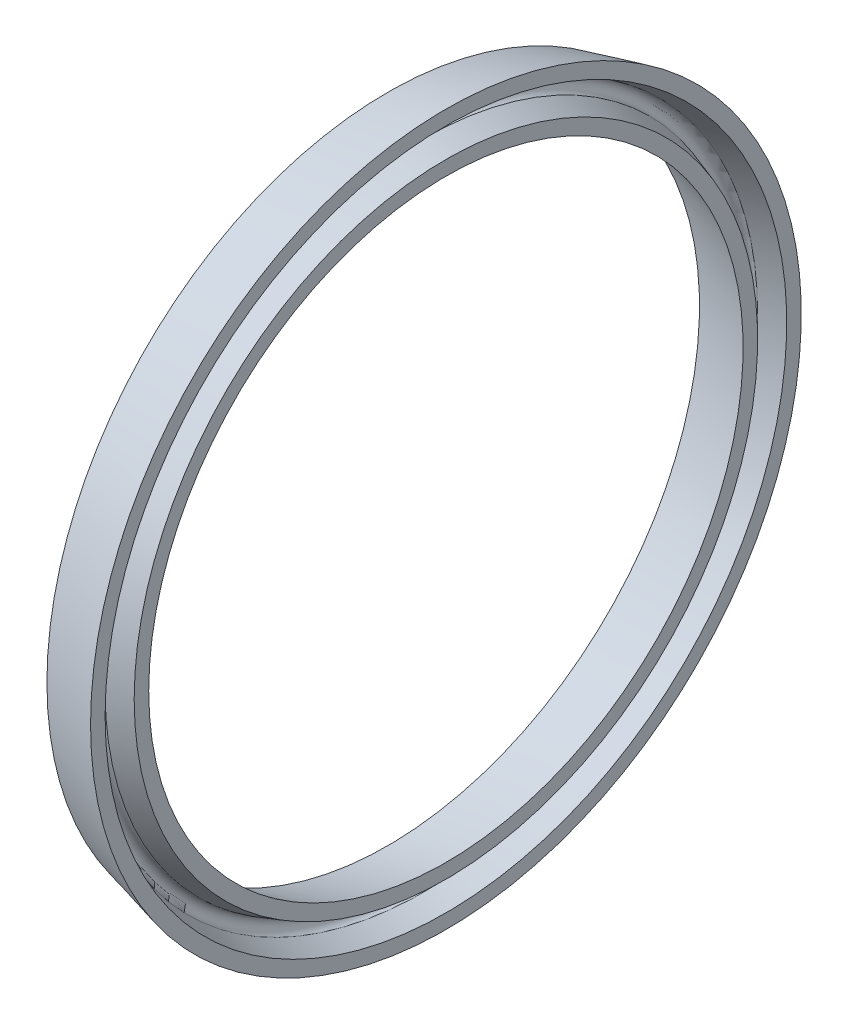
ISO-10303-21;
HEADER;
FILE_DESCRIPTION(('STEP AP214'),'2;1');
FILE_NAME('part.step','',(''),(''),'','','');
FILE_SCHEMA(('AUTOMOTIVE_DESIGN { 1 0 10303 214 1 1 1 1 }'));
ENDSEC;
DATA;
#1=APPLICATION_CONTEXT('core data for automotive mechanical design processes');
#2=APPLICATION_PROTOCOL_DEFINITION('international standard','automotive_design',2000,#1);
#3=PRODUCT_CONTEXT('',#1,'mechanical');
#4=PRODUCT('Part','Part','',(#3));
#5=PRODUCT_RELATED_PRODUCT_CATEGORY('part','',(#4));
#6=PRODUCT_DEFINITION_FORMATION('','',#4);
#7=PRODUCT_DEFINITION_CONTEXT('part definition',#1,'design');
#8=PRODUCT_DEFINITION('design','',#6,#7);
#9=PRODUCT_DEFINITION_SHAPE('','',#8);
#10=(LENGTH_UNIT() NAMED_UNIT(*) SI_UNIT(.MILLI.,.METRE.));
#11=(NAMED_UNIT(*) PLANE_ANGLE_UNIT() SI_UNIT($,.RADIAN.));
#12=(NAMED_UNIT(*) SI_UNIT($,.STERADIAN.) SOLID_ANGLE_UNIT());
#13=UNCERTAINTY_MEASURE_WITH_UNIT(LENGTH_MEASURE(1.E-05),#10,'distance_accuracy_value','');
#14=(GEOMETRIC_REPRESENTATION_CONTEXT(3) GLOBAL_UNCERTAINTY_ASSIGNED_CONTEXT((#13)) GLOBAL_UNIT_ASSIGNED_CONTEXT((#10,
#11,#12)) REPRESENTATION_CONTEXT('',''));
#15=CARTESIAN_POINT('',(0.,0.,0.));
#16=DIRECTION('',(0.,0.,1.));
#17=DIRECTION('',(1.,0.,0.));
#18=AXIS2_PLACEMENT_3D('',#15,#16,#17);
#19=CARTESIAN_POINT('',(0.,70.3100000000031,0.));
#20=DIRECTION('',(-1.,0.,0.));
#21=DIRECTION('',(0.,0.,1.));
#22=AXIS2_PLACEMENT_3D('',#19,#20,#21);
#23=PLANE('',#22);
#24=CARTESIAN_POINT('',(0.,0.,0.));
#25=DIRECTION('',(-1.,0.,0.));
#26=DIRECTION('',(0.,0.,1.));
#27=AXIS2_PLACEMENT_3D('',#24,#25,#26);
#28=CIRCLE('',#27,73.31);
#29=CARTESIAN_POINT('',(0.,0.,73.31));
#30=VERTEX_POINT('',#29);
#31=EDGE_CURVE('E10',#30,#30,#28,.T.);
#32=ORIENTED_EDGE('',*,*,#31,.F.);
#33=EDGE_LOOP('',(#32));
#34=FACE_BOUND('',#33,.T.);
#35=CARTESIAN_POINT('',(0.,0.,0.));
#36=DIRECTION('',(-1.,0.,0.));
#37=DIRECTION('',(0.,0.,1.));
#38=AXIS2_PLACEMENT_3D('',#35,#36,#37);
#39=CIRCLE('',#38,70.3100000000031);
#40=CARTESIAN_POINT('',(0.,0.,70.3100000000031));
#41=VERTEX_POINT('',#40);
#42=EDGE_CURVE('E67',#41,#41,#39,.T.);
#43=ORIENTED_EDGE('',*,*,#42,.T.);
#44=EDGE_LOOP('',(#43));
#45=FACE_BOUND('',#44,.T.);
#46=ADVANCED_FACE('F39',(#34,#45),#23,.F.);
#47=CARTESIAN_POINT('',(0.,0.,0.));
#48=DIRECTION('',(1.,0.,0.));
#49=DIRECTION('',(0.,0.,-1.));
#50=AXIS2_PLACEMENT_3D('',#47,#48,#49);
#51=CONICAL_SURFACE('',#50,73.31,0.244978663126863);
#52=CARTESIAN_POINT('',(-12.,0.,0.));
#53=DIRECTION('',(-1.,0.,0.));
#54=DIRECTION('',(0.,0.,1.));
#55=AXIS2_PLACEMENT_3D('',#52,#53,#54);
#56=CIRCLE('',#55,70.31);
#57=CARTESIAN_POINT('',(-12.,0.,70.31));
#58=VERTEX_POINT('',#57);
#59=EDGE_CURVE('E45',#58,#58,#56,.T.);
#60=ORIENTED_EDGE('',*,*,#59,.F.);
#61=EDGE_LOOP('',(#60));
#62=FACE_BOUND('',#61,.T.);
#63=ORIENTED_EDGE('',*,*,#31,.T.);
#64=EDGE_LOOP('',(#63));
#65=FACE_BOUND('',#64,.T.);
#66=ADVANCED_FACE('F104',(#62,#65),#51,.T.);
#67=CARTESIAN_POINT('',(-12.,70.31,0.));
#68=DIRECTION('',(1.,0.,0.));
#69=DIRECTION('',(0.,0.,-1.));
#70=AXIS2_PLACEMENT_3D('',#67,#68,#69);
#71=PLANE('',#70);
#72=CARTESIAN_POINT('',(-12.,0.,0.));
#73=DIRECTION('',(-1.,0.,0.));
#74=DIRECTION('',(0.,0.,1.));
#75=AXIS2_PLACEMENT_3D('',#72,#73,#74);
#76=CIRCLE('',#75,64.31);
#77=CARTESIAN_POINT('',(-12.,0.,64.31));
#78=VERTEX_POINT('',#77);
#79=EDGE_CURVE('E49',#78,#78,#76,.T.);
#80=ORIENTED_EDGE('',*,*,#79,.F.);
#81=EDGE_LOOP('',(#80));
#82=FACE_BOUND('',#81,.T.);
#83=ORIENTED_EDGE('',*,*,#59,.T.);
#84=EDGE_LOOP('',(#83));
#85=FACE_BOUND('',#84,.T.);
#86=ADVANCED_FACE('F99',(#82,#85),#71,.F.);
#87=CARTESIAN_POINT('',(-12.,0.,0.));
#88=DIRECTION('',(-1.,0.,0.));
#89=DIRECTION('',(0.,0.,1.));
#90=AXIS2_PLACEMENT_3D('',#87,#88,#89);
#91=CONICAL_SURFACE('',#90,64.31,0.244978663126863);
#92=CARTESIAN_POINT('',(0.,0.,0.));
#93=DIRECTION('',(-1.,0.,0.));
#94=DIRECTION('',(0.,0.,1.));
#95=AXIS2_PLACEMENT_3D('',#92,#93,#94);
#96=CIRCLE('',#95,61.31);
#97=CARTESIAN_POINT('',(0.,0.,61.31));
#98=VERTEX_POINT('',#97);
#99=EDGE_CURVE('E53',#98,#98,#96,.T.);
#100=ORIENTED_EDGE('',*,*,#99,.F.);
#101=EDGE_LOOP('',(#100));
#102=FACE_BOUND('',#101,.T.);
#103=ORIENTED_EDGE('',*,*,#79,.T.);
#104=EDGE_LOOP('',(#103));
#105=FACE_BOUND('',#104,.T.);
#106=ADVANCED_FACE('F93',(#102,#105),#91,.F.);
#107=CARTESIAN_POINT('',(0.,61.31,0.));
#108=DIRECTION('',(-1.,0.,0.));
#109=DIRECTION('',(0.,0.,1.));
#110=AXIS2_PLACEMENT_3D('',#107,#108,#109);
#111=PLANE('',#110);
#112=CARTESIAN_POINT('',(0.,0.,0.));
#113=DIRECTION('',(-1.,0.,0.));
#114=DIRECTION('',(0.,0.,1.));
#115=AXIS2_PLACEMENT_3D('',#112,#113,#114);
#116=CIRCLE('',#115,64.31);
#117=CARTESIAN_POINT('',(0.,0.,64.31));
#118=VERTEX_POINT('',#117);
#119=EDGE_CURVE('E58',#118,#118,#116,.T.);
#120=ORIENTED_EDGE('',*,*,#119,.F.);
#121=EDGE_LOOP('',(#120));
#122=FACE_BOUND('',#121,.T.);
#123=ORIENTED_EDGE('',*,*,#99,.T.);
#124=EDGE_LOOP('',(#123));
#125=FACE_BOUND('',#124,.T.);
#126=ADVANCED_FACE('F87',(#122,#125),#111,.F.);
#127=CARTESIAN_POINT('',(0.,0.,0.));
#128=DIRECTION('',(-1.,0.,0.));
#129=DIRECTION('',(0.,0.,1.));
#130=AXIS2_PLACEMENT_3D('',#127,#128,#129);
#131=CONICAL_SURFACE('',#130,64.31,0.32175055439664);
#132=CARTESIAN_POINT('',(-4.50000000000001,0.,0.));
#133=DIRECTION('',(-1.,0.,0.));
#134=DIRECTION('',(0.,0.,1.));
#135=AXIS2_PLACEMENT_3D('',#132,#133,#134);
#136=CIRCLE('',#135,65.81);
#137=CARTESIAN_POINT('',(-4.50000000000001,0.,65.81));
#138=VERTEX_POINT('',#137);
#139=EDGE_CURVE('E61',#138,#138,#136,.T.);
#140=ORIENTED_EDGE('',*,*,#139,.F.);
#141=EDGE_LOOP('',(#140));
#142=FACE_BOUND('',#141,.T.);
#143=ORIENTED_EDGE('',*,*,#119,.T.);
#144=EDGE_LOOP('',(#143));
#145=FACE_BOUND('',#144,.T.);
#146=ADVANCED_FACE('F81',(#142,#145),#131,.T.);
#147=CARTESIAN_POINT('',(-4.50000000000001,0.,0.));
#148=DIRECTION('',(-1.,0.,0.));
#149=DIRECTION('',(0.,0.,1.));
#150=AXIS2_PLACEMENT_3D('',#147,#148,#149);
#151=TOROIDAL_SURFACE('',#150,67.31,1.5);
#152=CARTESIAN_POINT('',(-4.50000000000001,0.,0.));
#153=DIRECTION('',(-1.,0.,0.));
#154=DIRECTION('',(0.,0.,1.));
#155=AXIS2_PLACEMENT_3D('',#152,#153,#154);
#156=CIRCLE('',#155,68.81);
#157=CARTESIAN_POINT('',(-4.50000000000001,0.,68.81));
#158=VERTEX_POINT('',#157);
#159=EDGE_CURVE('E64',#158,#158,#156,.T.);
#160=ORIENTED_EDGE('',*,*,#159,.F.);
#161=EDGE_LOOP('',(#160));
#162=FACE_BOUND('',#161,.T.);
#163=ORIENTED_EDGE('',*,*,#139,.T.);
#164=EDGE_LOOP('',(#163));
#165=FACE_BOUND('',#164,.T.);
#166=ADVANCED_FACE('F75',(#162,#165),#151,.F.);
#167=CARTESIAN_POINT('',(-4.50000000000001,0.,0.));
#168=DIRECTION('',(1.,0.,0.));
#169=DIRECTION('',(0.,0.,-1.));
#170=AXIS2_PLACEMENT_3D('',#167,#168,#169);
#171=CONICAL_SURFACE('',#170,68.81,0.321750554397272);
#172=ORIENTED_EDGE('',*,*,#42,.F.);
#173=EDGE_LOOP('',(#172));
#174=FACE_BOUND('',#173,.T.);
#175=ORIENTED_EDGE('',*,*,#159,.T.);
#176=EDGE_LOOP('',(#175));
#177=FACE_BOUND('',#176,.T.);
#178=ADVANCED_FACE('F72',(#174,#177),#171,.F.);
#179=CLOSED_SHELL('',(#46,#66,#86,#106,#126,#146,#166,#178));
#180=MANIFOLD_SOLID_BREP('B2',#179);
#181=ADVANCED_BREP_SHAPE_REPRESENTATION('',(#18,#180),#14);
#182=SHAPE_DEFINITION_REPRESENTATION(#9,#181);
ENDSEC;
END-ISO-10303-21;
